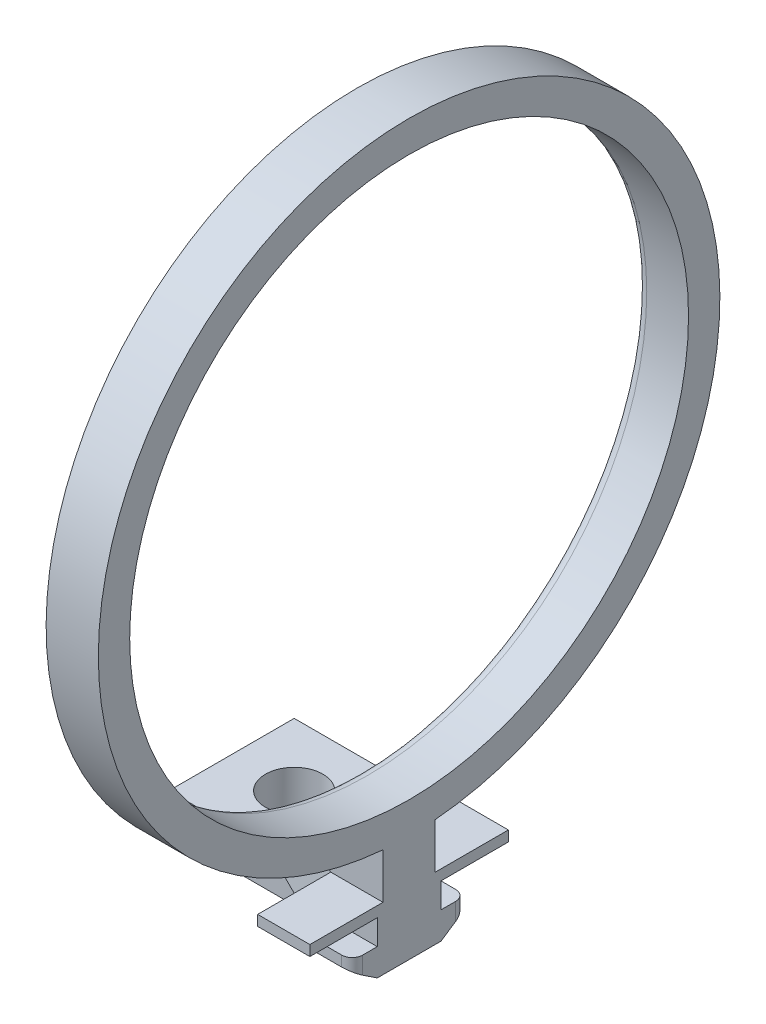
ISO-10303-21;
HEADER;
FILE_DESCRIPTION(('STEP AP214'),'2;1');
FILE_NAME('part.step','',(''),(''),'','','');
FILE_SCHEMA(('AUTOMOTIVE_DESIGN { 1 0 10303 214 1 1 1 1 }'));
ENDSEC;
DATA;
#1=APPLICATION_CONTEXT('core data for automotive mechanical design processes');
#2=APPLICATION_PROTOCOL_DEFINITION('international standard','automotive_design',2000,#1);
#3=PRODUCT_CONTEXT('',#1,'mechanical');
#4=PRODUCT('Part','Part','',(#3));
#5=PRODUCT_RELATED_PRODUCT_CATEGORY('part','',(#4));
#6=PRODUCT_DEFINITION_FORMATION('','',#4);
#7=PRODUCT_DEFINITION_CONTEXT('part definition',#1,'design');
#8=PRODUCT_DEFINITION('design','',#6,#7);
#9=PRODUCT_DEFINITION_SHAPE('','',#8);
#10=(LENGTH_UNIT() NAMED_UNIT(*) SI_UNIT(.MILLI.,.METRE.));
#11=(NAMED_UNIT(*) PLANE_ANGLE_UNIT() SI_UNIT($,.RADIAN.));
#12=(NAMED_UNIT(*) SI_UNIT($,.STERADIAN.) SOLID_ANGLE_UNIT());
#13=UNCERTAINTY_MEASURE_WITH_UNIT(LENGTH_MEASURE(1.E-05),#10,'distance_accuracy_value','');
#14=(GEOMETRIC_REPRESENTATION_CONTEXT(3) GLOBAL_UNCERTAINTY_ASSIGNED_CONTEXT((#13)) GLOBAL_UNIT_ASSIGNED_CONTEXT((#10,
#11,#12)) REPRESENTATION_CONTEXT('',''));
#15=CARTESIAN_POINT('',(0.,0.,0.));
#16=DIRECTION('',(0.,0.,1.));
#17=DIRECTION('',(1.,0.,0.));
#18=AXIS2_PLACEMENT_3D('',#15,#16,#17);
#19=CARTESIAN_POINT('',(-5.,0.,0.));
#20=DIRECTION('',(1.,0.,0.));
#21=DIRECTION('',(0.,0.,-1.));
#22=AXIS2_PLACEMENT_3D('',#19,#20,#21);
#23=PLANE('',#22);
#24=DIRECTION('',(0.,1.,0.));
#25=VECTOR('',#24,1.);
#26=CARTESIAN_POINT('',(-5.,-31.5,5.99999999999999));
#27=LINE('',#26,#25);
#28=CARTESIAN_POINT('',(-5.,-35.,5.99999999999999));
#29=VERTEX_POINT('',#28);
#30=CARTESIAN_POINT('',(-5.,-34.,5.99999999999999));
#31=VERTEX_POINT('',#30);
#32=EDGE_CURVE('E237',#29,#31,#27,.T.);
#33=ORIENTED_EDGE('',*,*,#32,.F.);
#34=DIRECTION('',(0.,0.,-1.));
#35=VECTOR('',#34,1.);
#36=CARTESIAN_POINT('',(-5.,-35.,3.05));
#37=LINE('',#36,#35);
#38=CARTESIAN_POINT('',(-5.,-35.,9.5));
#39=VERTEX_POINT('',#38);
#40=EDGE_CURVE('E260',#39,#29,#37,.T.);
#41=ORIENTED_EDGE('',*,*,#40,.F.);
#42=DIRECTION('',(0.,-1.,0.));
#43=VECTOR('',#42,1.);
#44=CARTESIAN_POINT('',(-5.,-35.,9.5));
#45=LINE('',#44,#43);
#46=CARTESIAN_POINT('',(-5.,-34.,9.50000000000001));
#47=VERTEX_POINT('',#46);
#48=EDGE_CURVE('E254',#47,#39,#45,.T.);
#49=ORIENTED_EDGE('',*,*,#48,.F.);
#50=DIRECTION('',(0.,0.,1.));
#51=VECTOR('',#50,1.);
#52=CARTESIAN_POINT('',(-5.,-34.,9.50000000000001));
#53=LINE('',#52,#51);
#54=EDGE_CURVE('E256',#31,#47,#53,.T.);
#55=ORIENTED_EDGE('',*,*,#54,.F.);
#56=EDGE_LOOP('',(#33,#41,#49,#55));
#57=FACE_BOUND('',#56,.T.);
#58=ADVANCED_FACE('F36',(#57),#23,.F.);
#59=DIRECTION('',(0.,0.,1.));
#60=VECTOR('',#59,1.);
#61=CARTESIAN_POINT('',(-5.,-35.,-6.00000000000001));
#62=LINE('',#61,#60);
#63=CARTESIAN_POINT('',(-5.,-35.,-3.05));
#64=VERTEX_POINT('',#63);
#65=CARTESIAN_POINT('',(-5.,-35.,3.05));
#66=VERTEX_POINT('',#65);
#67=EDGE_CURVE('E413',#64,#66,#62,.T.);
#68=ORIENTED_EDGE('',*,*,#67,.F.);
#69=DIRECTION('',(0.,1.,0.));
#70=VECTOR('',#69,1.);
#71=CARTESIAN_POINT('',(-5.,-35.,-3.05));
#72=LINE('',#71,#70);
#73=CARTESIAN_POINT('',(-5.,-37.4,-3.05));
#74=VERTEX_POINT('',#73);
#75=EDGE_CURVE('E287',#74,#64,#72,.T.);
#76=ORIENTED_EDGE('',*,*,#75,.F.);
#77=DIRECTION('',(0.,0.,1.));
#78=VECTOR('',#77,1.);
#79=CARTESIAN_POINT('',(-5.,-37.4,-3.05));
#80=LINE('',#79,#78);
#81=CARTESIAN_POINT('',(-5.,-37.4,-5.45));
#82=VERTEX_POINT('',#81);
#83=EDGE_CURVE('E284',#82,#74,#80,.T.);
#84=ORIENTED_EDGE('',*,*,#83,.F.);
#85=DIRECTION('',(0.,1.,0.));
#86=VECTOR('',#85,1.);
#87=CARTESIAN_POINT('',(-5.,-37.4,-5.45));
#88=LINE('',#87,#86);
#89=CARTESIAN_POINT('',(-5.,-38.4,-5.45));
#90=VERTEX_POINT('',#89);
#91=EDGE_CURVE('E281',#90,#82,#88,.T.);
#92=ORIENTED_EDGE('',*,*,#91,.F.);
#93=DIRECTION('',(0.,0.55470019622523,-0.832050294337843));
#94=VECTOR('',#93,1.);
#95=CARTESIAN_POINT('',(-5.,-38.4,-5.45));
#96=LINE('',#95,#94);
#97=CARTESIAN_POINT('',(-5.,-40.,-3.05));
#98=VERTEX_POINT('',#97);
#99=EDGE_CURVE('E278',#98,#90,#96,.T.);
#100=ORIENTED_EDGE('',*,*,#99,.F.);
#101=DIRECTION('',(0.,0.,-1.));
#102=VECTOR('',#101,1.);
#103=CARTESIAN_POINT('',(-5.,-40.,-3.05));
#104=LINE('',#103,#102);
#105=CARTESIAN_POINT('',(-5.,-40.,3.05));
#106=VERTEX_POINT('',#105);
#107=EDGE_CURVE('E275',#106,#98,#104,.T.);
#108=ORIENTED_EDGE('',*,*,#107,.F.);
#109=DIRECTION('',(0.,-0.554700196225229,-0.832050294337844));
#110=VECTOR('',#109,1.);
#111=CARTESIAN_POINT('',(-5.,-38.4,5.45));
#112=LINE('',#111,#110);
#113=CARTESIAN_POINT('',(-5.,-38.4,5.45));
#114=VERTEX_POINT('',#113);
#115=EDGE_CURVE('E272',#114,#106,#112,.T.);
#116=ORIENTED_EDGE('',*,*,#115,.F.);
#117=DIRECTION('',(0.,-1.,0.));
#118=VECTOR('',#117,1.);
#119=CARTESIAN_POINT('',(-5.,-37.4,5.45));
#120=LINE('',#119,#118);
#121=CARTESIAN_POINT('',(-5.,-37.4,5.45));
#122=VERTEX_POINT('',#121);
#123=EDGE_CURVE('E269',#122,#114,#120,.T.);
#124=ORIENTED_EDGE('',*,*,#123,.F.);
#125=DIRECTION('',(0.,0.,1.));
#126=VECTOR('',#125,1.);
#127=CARTESIAN_POINT('',(-5.,-37.4,3.05));
#128=LINE('',#127,#126);
#129=CARTESIAN_POINT('',(-5.,-37.4,3.05));
#130=VERTEX_POINT('',#129);
#131=EDGE_CURVE('E266',#130,#122,#128,.T.);
#132=ORIENTED_EDGE('',*,*,#131,.F.);
#133=DIRECTION('',(0.,-1.,0.));
#134=VECTOR('',#133,1.);
#135=CARTESIAN_POINT('',(-5.,-35.,3.05));
#136=LINE('',#135,#134);
#137=EDGE_CURVE('E263',#66,#130,#136,.T.);
#138=ORIENTED_EDGE('',*,*,#137,.F.);
#139=EDGE_LOOP('',(#68,#76,#84,#92,#100,#108,#116,#124,#132,#138));
#140=FACE_BOUND('',#139,.T.);
#141=ADVANCED_FACE('F440',(#140),#23,.F.);
#142=DIRECTION('',(0.,-1.,0.));
#143=VECTOR('',#142,1.);
#144=CARTESIAN_POINT('',(-5.,-31.5,-6.00000000000001));
#145=LINE('',#144,#143);
#146=CARTESIAN_POINT('',(-5.,-34.,-6.00000000000001));
#147=VERTEX_POINT('',#146);
#148=CARTESIAN_POINT('',(-5.,-35.,-6.00000000000001));
#149=VERTEX_POINT('',#148);
#150=EDGE_CURVE('E465',#147,#149,#145,.T.);
#151=ORIENTED_EDGE('',*,*,#150,.F.);
#152=CARTESIAN_POINT('',(-5.,-34.,-9.5));
#153=VERTEX_POINT('',#152);
#154=EDGE_CURVE('E251',#153,#147,#53,.T.);
#155=ORIENTED_EDGE('',*,*,#154,.F.);
#156=DIRECTION('',(0.,1.,0.));
#157=VECTOR('',#156,1.);
#158=CARTESIAN_POINT('',(-5.,-34.,-9.5));
#159=LINE('',#158,#157);
#160=CARTESIAN_POINT('',(-5.,-35.,-9.5));
#161=VERTEX_POINT('',#160);
#162=EDGE_CURVE('E292',#161,#153,#159,.T.);
#163=ORIENTED_EDGE('',*,*,#162,.F.);
#164=DIRECTION('',(0.,0.,-1.));
#165=VECTOR('',#164,1.);
#166=CARTESIAN_POINT('',(-5.,-35.,-3.05));
#167=LINE('',#166,#165);
#168=EDGE_CURVE('E290',#149,#161,#167,.T.);
#169=ORIENTED_EDGE('',*,*,#168,.F.);
#170=EDGE_LOOP('',(#151,#155,#163,#169));
#171=FACE_BOUND('',#170,.T.);
#172=ADVANCED_FACE('F446',(#171),#23,.F.);
#173=CARTESIAN_POINT('',(-5.,0.,0.));
#174=DIRECTION('',(1.,0.,0.));
#175=DIRECTION('',(0.,0.,-1.));
#176=AXIS2_PLACEMENT_3D('',#173,#174,#175);
#177=CIRCLE('',#176,27.75);
#178=CARTESIAN_POINT('',(-5.,0.,-27.75));
#179=VERTEX_POINT('',#178);
#180=EDGE_CURVE('E44',#179,#179,#177,.T.);
#181=ORIENTED_EDGE('',*,*,#180,.T.);
#182=EDGE_LOOP('',(#181));
#183=FACE_BOUND('',#182,.T.);
#184=DIRECTION('',(0.,0.,-1.));
#185=VECTOR('',#184,1.);
#186=CARTESIAN_POINT('',(-5.,-31.5,-6.00000000000001));
#187=LINE('',#186,#185);
#188=CARTESIAN_POINT('',(-5.,-31.5,2.5));
#189=VERTEX_POINT('',#188);
#190=CARTESIAN_POINT('',(-5.,-31.5,-2.5));
#191=VERTEX_POINT('',#190);
#192=EDGE_CURVE('E410',#189,#191,#187,.T.);
#193=ORIENTED_EDGE('',*,*,#192,.F.);
#194=DIRECTION('',(0.,-1.,0.));
#195=VECTOR('',#194,1.);
#196=CARTESIAN_POINT('',(-5.,-35.,2.5));
#197=LINE('',#196,#195);
#198=CARTESIAN_POINT('',(-5.,-29.6447718830825,2.5));
#199=VERTEX_POINT('',#198);
#200=EDGE_CURVE('E367',#199,#189,#197,.T.);
#201=ORIENTED_EDGE('',*,*,#200,.F.);
#202=CARTESIAN_POINT('',(-5.,0.,0.));
#203=DIRECTION('',(1.,0.,0.));
#204=DIRECTION('',(0.,0.,-1.));
#205=AXIS2_PLACEMENT_3D('',#202,#203,#204);
#206=CIRCLE('',#205,29.75);
#207=CARTESIAN_POINT('',(-5.,-29.6447718830825,-2.5));
#208=VERTEX_POINT('',#207);
#209=EDGE_CURVE('E381',#208,#199,#206,.T.);
#210=ORIENTED_EDGE('',*,*,#209,.F.);
#211=DIRECTION('',(0.,1.,0.));
#212=VECTOR('',#211,1.);
#213=CARTESIAN_POINT('',(-5.,-35.,-2.5));
#214=LINE('',#213,#212);
#215=EDGE_CURVE('E365',#191,#208,#214,.T.);
#216=ORIENTED_EDGE('',*,*,#215,.F.);
#217=EDGE_LOOP('',(#193,#201,#210,#216));
#218=FACE_BOUND('',#217,.T.);
#219=ADVANCED_FACE('F427',(#183,#218),#23,.F.);
#220=CARTESIAN_POINT('',(-5.,0.,0.));
#221=DIRECTION('',(1.,0.,0.));
#222=DIRECTION('',(0.,0.,-1.));
#223=AXIS2_PLACEMENT_3D('',#220,#221,#222);
#224=CYLINDRICAL_SURFACE('',#223,29.75);
#225=DIRECTION('',(1.,0.,0.));
#226=VECTOR('',#225,1.);
#227=CARTESIAN_POINT('',(-5.,-29.6447718830825,2.5));
#228=LINE('',#227,#226);
#229=CARTESIAN_POINT('',(0.,-29.6447718830825,2.5));
#230=VERTEX_POINT('',#229);
#231=EDGE_CURVE('E375',#199,#230,#228,.T.);
#232=ORIENTED_EDGE('',*,*,#231,.T.);
#233=CARTESIAN_POINT('',(0.,0.,0.));
#234=DIRECTION('',(1.,0.,0.));
#235=DIRECTION('',(0.,0.,-1.));
#236=AXIS2_PLACEMENT_3D('',#233,#234,#235);
#237=CIRCLE('',#236,29.75);
#238=CARTESIAN_POINT('',(0.,-29.6447718830825,-2.50000000000004));
#239=VERTEX_POINT('',#238);
#240=EDGE_CURVE('E378',#239,#230,#237,.T.);
#241=ORIENTED_EDGE('',*,*,#240,.F.);
#242=DIRECTION('',(1.,0.,0.));
#243=VECTOR('',#242,1.);
#244=CARTESIAN_POINT('',(-5.,-29.6447718830825,-2.5));
#245=LINE('',#244,#243);
#246=EDGE_CURVE('E371',#208,#239,#245,.T.);
#247=ORIENTED_EDGE('',*,*,#246,.F.);
#248=ORIENTED_EDGE('',*,*,#209,.T.);
#249=EDGE_LOOP('',(#232,#241,#247,#248));
#250=FACE_BOUND('',#249,.T.);
#251=ADVANCED_FACE('F451',(#250),#224,.T.);
#252=CARTESIAN_POINT('',(-5.,0.,0.));
#253=DIRECTION('',(1.,0.,0.));
#254=DIRECTION('',(0.,0.,-1.));
#255=AXIS2_PLACEMENT_3D('',#252,#253,#254);
#256=CYLINDRICAL_SURFACE('',#255,26.75);
#257=CARTESIAN_POINT('',(-4.,0.,0.));
#258=DIRECTION('',(1.,0.,0.));
#259=DIRECTION('',(0.,0.,-1.));
#260=AXIS2_PLACEMENT_3D('',#257,#258,#259);
#261=CIRCLE('',#260,26.75);
#262=CARTESIAN_POINT('',(-4.,0.,-26.75));
#263=VERTEX_POINT('',#262);
#264=EDGE_CURVE('E11',#263,#263,#261,.F.);
#265=ORIENTED_EDGE('',*,*,#264,.T.);
#266=EDGE_LOOP('',(#265));
#267=FACE_BOUND('',#266,.T.);
#268=CARTESIAN_POINT('',(0.,0.,0.));
#269=DIRECTION('',(1.,0.,0.));
#270=DIRECTION('',(0.,0.,-1.));
#271=AXIS2_PLACEMENT_3D('',#268,#269,#270);
#272=CIRCLE('',#271,26.75);
#273=CARTESIAN_POINT('',(0.,0.,-26.75));
#274=VERTEX_POINT('',#273);
#275=EDGE_CURVE('E385',#274,#274,#272,.T.);
#276=ORIENTED_EDGE('',*,*,#275,.T.);
#277=EDGE_LOOP('',(#276));
#278=FACE_BOUND('',#277,.T.);
#279=ADVANCED_FACE('F456',(#267,#278),#256,.F.);
#280=CARTESIAN_POINT('',(0.,0.,0.));
#281=DIRECTION('',(1.,0.,0.));
#282=DIRECTION('',(0.,0.,-1.));
#283=AXIS2_PLACEMENT_3D('',#280,#281,#282);
#284=PLANE('',#283);
#285=DIRECTION('',(0.,0.,1.));
#286=VECTOR('',#285,1.);
#287=CARTESIAN_POINT('',(0.,-37.4,3.05));
#288=LINE('',#287,#286);
#289=CARTESIAN_POINT('',(0.,-37.4,3.05));
#290=VERTEX_POINT('',#289);
#291=CARTESIAN_POINT('',(0.,-37.4,4.45));
#292=VERTEX_POINT('',#291);
#293=EDGE_CURVE('E306',#290,#292,#288,.T.);
#294=ORIENTED_EDGE('',*,*,#293,.T.);
#295=DIRECTION('',(0.,-1.,0.));
#296=VECTOR('',#295,1.);
#297=CARTESIAN_POINT('',(0.,0.,4.45000000000013));
#298=LINE('',#297,#296);
#299=CARTESIAN_POINT('',(0.,-39.0666666666667,4.44999999999999));
#300=VERTEX_POINT('',#299);
#301=EDGE_CURVE('E395',#292,#300,#298,.T.);
#302=ORIENTED_EDGE('',*,*,#301,.T.);
#303=DIRECTION('',(0.,-0.554700196225229,-0.832050294337844));
#304=VECTOR('',#303,1.);
#305=CARTESIAN_POINT('',(0.,-38.4,5.45));
#306=LINE('',#305,#304);
#307=CARTESIAN_POINT('',(0.,-40.,3.05));
#308=VERTEX_POINT('',#307);
#309=EDGE_CURVE('E309',#300,#308,#306,.T.);
#310=ORIENTED_EDGE('',*,*,#309,.T.);
#311=DIRECTION('',(0.,0.,-1.));
#312=VECTOR('',#311,1.);
#313=CARTESIAN_POINT('',(0.,-40.,-3.05));
#314=LINE('',#313,#312);
#315=CARTESIAN_POINT('',(0.,-40.,-3.05));
#316=VERTEX_POINT('',#315);
#317=EDGE_CURVE('E311',#308,#316,#314,.T.);
#318=ORIENTED_EDGE('',*,*,#317,.T.);
#319=DIRECTION('',(0.,0.55470019622523,-0.832050294337843));
#320=VECTOR('',#319,1.);
#321=CARTESIAN_POINT('',(0.,-38.4,-5.45));
#322=LINE('',#321,#320);
#323=CARTESIAN_POINT('',(0.,-39.0666666666667,-4.45));
#324=VERTEX_POINT('',#323);
#325=EDGE_CURVE('E314',#316,#324,#322,.T.);
#326=ORIENTED_EDGE('',*,*,#325,.T.);
#327=DIRECTION('',(0.,1.,0.));
#328=VECTOR('',#327,1.);
#329=CARTESIAN_POINT('',(0.,0.,-4.45000000000003));
#330=LINE('',#329,#328);
#331=CARTESIAN_POINT('',(0.,-37.4,-4.45));
#332=VERTEX_POINT('',#331);
#333=EDGE_CURVE('E392',#324,#332,#330,.T.);
#334=ORIENTED_EDGE('',*,*,#333,.T.);
#335=DIRECTION('',(0.,0.,1.));
#336=VECTOR('',#335,1.);
#337=CARTESIAN_POINT('',(0.,-37.4,-3.05));
#338=LINE('',#337,#336);
#339=CARTESIAN_POINT('',(0.,-37.4,-3.05));
#340=VERTEX_POINT('',#339);
#341=EDGE_CURVE('E317',#332,#340,#338,.T.);
#342=ORIENTED_EDGE('',*,*,#341,.T.);
#343=DIRECTION('',(0.,1.,0.));
#344=VECTOR('',#343,1.);
#345=CARTESIAN_POINT('',(0.,-35.,-3.05));
#346=LINE('',#345,#344);
#347=CARTESIAN_POINT('',(0.,-35.,-3.05));
#348=VERTEX_POINT('',#347);
#349=EDGE_CURVE('E319',#340,#348,#346,.T.);
#350=ORIENTED_EDGE('',*,*,#349,.T.);
#351=DIRECTION('',(0.,0.,-1.));
#352=VECTOR('',#351,1.);
#353=CARTESIAN_POINT('',(0.,-35.,-3.05));
#354=LINE('',#353,#352);
#355=CARTESIAN_POINT('',(0.,-35.,-9.5));
#356=VERTEX_POINT('',#355);
#357=EDGE_CURVE('E322',#348,#356,#354,.T.);
#358=ORIENTED_EDGE('',*,*,#357,.T.);
#359=DIRECTION('',(0.,1.,0.));
#360=VECTOR('',#359,1.);
#361=CARTESIAN_POINT('',(0.,-34.,-9.5));
#362=LINE('',#361,#360);
#363=CARTESIAN_POINT('',(0.,-34.,-9.5));
#364=VERTEX_POINT('',#363);
#365=EDGE_CURVE('E325',#356,#364,#362,.T.);
#366=ORIENTED_EDGE('',*,*,#365,.T.);
#367=DIRECTION('',(0.,0.,1.));
#368=VECTOR('',#367,1.);
#369=CARTESIAN_POINT('',(0.,-34.,9.50000000000001));
#370=LINE('',#369,#368);
#371=CARTESIAN_POINT('',(0.,-34.,-2.5));
#372=VERTEX_POINT('',#371);
#373=EDGE_CURVE('E245',#364,#372,#370,.T.);
#374=ORIENTED_EDGE('',*,*,#373,.T.);
#375=DIRECTION('',(0.,1.,0.));
#376=VECTOR('',#375,1.);
#377=CARTESIAN_POINT('',(0.,-35.,-2.5));
#378=LINE('',#377,#376);
#379=EDGE_CURVE('E364',#372,#239,#378,.T.);
#380=ORIENTED_EDGE('',*,*,#379,.T.);
#381=ORIENTED_EDGE('',*,*,#240,.T.);
#382=DIRECTION('',(0.,-1.,0.));
#383=VECTOR('',#382,1.);
#384=CARTESIAN_POINT('',(0.,-35.,2.5));
#385=LINE('',#384,#383);
#386=CARTESIAN_POINT('',(0.,-34.,2.5));
#387=VERTEX_POINT('',#386);
#388=EDGE_CURVE('E368',#230,#387,#385,.T.);
#389=ORIENTED_EDGE('',*,*,#388,.T.);
#390=CARTESIAN_POINT('',(0.,-34.,9.50000000000001));
#391=VERTEX_POINT('',#390);
#392=EDGE_CURVE('E243',#387,#391,#370,.T.);
#393=ORIENTED_EDGE('',*,*,#392,.T.);
#394=DIRECTION('',(0.,-1.,0.));
#395=VECTOR('',#394,1.);
#396=CARTESIAN_POINT('',(0.,-35.,9.5));
#397=LINE('',#396,#395);
#398=CARTESIAN_POINT('',(0.,-35.,9.5));
#399=VERTEX_POINT('',#398);
#400=EDGE_CURVE('E297',#391,#399,#397,.T.);
#401=ORIENTED_EDGE('',*,*,#400,.T.);
#402=DIRECTION('',(0.,0.,-1.));
#403=VECTOR('',#402,1.);
#404=CARTESIAN_POINT('',(0.,-35.,3.05));
#405=LINE('',#404,#403);
#406=CARTESIAN_POINT('',(0.,-35.,3.05));
#407=VERTEX_POINT('',#406);
#408=EDGE_CURVE('E300',#399,#407,#405,.T.);
#409=ORIENTED_EDGE('',*,*,#408,.T.);
#410=DIRECTION('',(0.,-1.,0.));
#411=VECTOR('',#410,1.);
#412=CARTESIAN_POINT('',(0.,-35.,3.05));
#413=LINE('',#412,#411);
#414=EDGE_CURVE('E303',#407,#290,#413,.T.);
#415=ORIENTED_EDGE('',*,*,#414,.T.);
#416=EDGE_LOOP('',(#294,#302,#310,#318,#326,#334,#342,#350,#358,#366,#374,#380,#381,#389,#393,
#401,#409,#415));
#417=FACE_BOUND('',#416,.T.);
#418=ORIENTED_EDGE('',*,*,#275,.F.);
#419=EDGE_LOOP('',(#418));
#420=FACE_BOUND('',#419,.T.);
#421=ADVANCED_FACE('F574',(#417,#420),#284,.T.);
#422=CARTESIAN_POINT('',(-5.,-35.,-2.5));
#423=DIRECTION('',(0.,0.,-1.));
#424=DIRECTION('',(0.,1.,0.));
#425=AXIS2_PLACEMENT_3D('',#422,#423,#424);
#426=PLANE('',#425);
#427=DIRECTION('',(1.,0.,0.));
#428=VECTOR('',#427,1.);
#429=CARTESIAN_POINT('',(-5.,-34.,-2.5));
#430=LINE('',#429,#428);
#431=CARTESIAN_POINT('',(-5.,-34.,-2.5));
#432=VERTEX_POINT('',#431);
#433=EDGE_CURVE('E330',#432,#372,#430,.T.);
#434=ORIENTED_EDGE('',*,*,#433,.F.);
#435=DIRECTION('',(0.707106781186546,-0.707106781186549,0.));
#436=VECTOR('',#435,1.);
#437=CARTESIAN_POINT('',(-7.50000000000003,-31.5,-2.5));
#438=LINE('',#437,#436);
#439=CARTESIAN_POINT('',(-7.50000000000003,-31.5,-2.5));
#440=VERTEX_POINT('',#439);
#441=EDGE_CURVE('E423',#432,#440,#438,.F.);
#442=ORIENTED_EDGE('',*,*,#441,.T.);
#443=DIRECTION('',(-1.,0.,0.));
#444=VECTOR('',#443,1.);
#445=CARTESIAN_POINT('',(-5.,-31.5,-2.5));
#446=LINE('',#445,#444);
#447=EDGE_CURVE('E51',#191,#440,#446,.T.);
#448=ORIENTED_EDGE('',*,*,#447,.F.);
#449=ORIENTED_EDGE('',*,*,#215,.T.);
#450=ORIENTED_EDGE('',*,*,#246,.T.);
#451=ORIENTED_EDGE('',*,*,#379,.F.);
#452=EDGE_LOOP('',(#434,#442,#448,#449,#450,#451));
#453=FACE_BOUND('',#452,.T.);
#454=ADVANCED_FACE('F571',(#453),#426,.T.);
#455=CARTESIAN_POINT('',(-5.,-35.,2.5));
#456=DIRECTION('',(0.,0.,1.));
#457=DIRECTION('',(0.,-1.,0.));
#458=AXIS2_PLACEMENT_3D('',#455,#456,#457);
#459=PLANE('',#458);
#460=DIRECTION('',(-1.,0.,0.));
#461=VECTOR('',#460,1.);
#462=CARTESIAN_POINT('',(-5.,-34.,2.5));
#463=LINE('',#462,#461);
#464=CARTESIAN_POINT('',(-5.,-34.,2.5));
#465=VERTEX_POINT('',#464);
#466=EDGE_CURVE('E384',#387,#465,#463,.T.);
#467=ORIENTED_EDGE('',*,*,#466,.F.);
#468=ORIENTED_EDGE('',*,*,#388,.F.);
#469=ORIENTED_EDGE('',*,*,#231,.F.);
#470=ORIENTED_EDGE('',*,*,#200,.T.);
#471=DIRECTION('',(1.,0.,0.));
#472=VECTOR('',#471,1.);
#473=CARTESIAN_POINT('',(-5.,-31.5,2.5));
#474=LINE('',#473,#472);
#475=CARTESIAN_POINT('',(-7.50000000000003,-31.5,2.5));
#476=VERTEX_POINT('',#475);
#477=EDGE_CURVE('E415',#476,#189,#474,.T.);
#478=ORIENTED_EDGE('',*,*,#477,.F.);
#479=DIRECTION('',(-0.707106781186546,0.707106781186549,0.));
#480=VECTOR('',#479,1.);
#481=CARTESIAN_POINT('',(-7.50000000000003,-31.5,2.5));
#482=LINE('',#481,#480);
#483=EDGE_CURVE('E59',#476,#465,#482,.F.);
#484=ORIENTED_EDGE('',*,*,#483,.T.);
#485=EDGE_LOOP('',(#467,#468,#469,#470,#478,#484));
#486=FACE_BOUND('',#485,.T.);
#487=ADVANCED_FACE('F569',(#486),#459,.T.);
#488=CARTESIAN_POINT('',(-5.,-34.,9.50000000000001));
#489=DIRECTION('',(0.,1.,0.));
#490=DIRECTION('',(0.,0.,1.));
#491=AXIS2_PLACEMENT_3D('',#488,#489,#490);
#492=PLANE('',#491);
#493=ORIENTED_EDGE('',*,*,#154,.T.);
#494=EDGE_CURVE('E255',#147,#432,#53,.T.);
#495=ORIENTED_EDGE('',*,*,#494,.T.);
#496=ORIENTED_EDGE('',*,*,#433,.T.);
#497=ORIENTED_EDGE('',*,*,#373,.F.);
#498=DIRECTION('',(1.,0.,0.));
#499=VECTOR('',#498,1.);
#500=CARTESIAN_POINT('',(-5.,-34.,-9.5));
#501=LINE('',#500,#499);
#502=EDGE_CURVE('E328',#153,#364,#501,.T.);
#503=ORIENTED_EDGE('',*,*,#502,.F.);
#504=EDGE_LOOP('',(#493,#495,#496,#497,#503));
#505=FACE_BOUND('',#504,.T.);
#506=ADVANCED_FACE('F473',(#505),#492,.T.);
#507=ORIENTED_EDGE('',*,*,#392,.F.);
#508=ORIENTED_EDGE('',*,*,#466,.T.);
#509=EDGE_CURVE('E257',#465,#31,#53,.T.);
#510=ORIENTED_EDGE('',*,*,#509,.T.);
#511=ORIENTED_EDGE('',*,*,#54,.T.);
#512=DIRECTION('',(1.,0.,0.));
#513=VECTOR('',#512,1.);
#514=CARTESIAN_POINT('',(-5.,-34.,9.50000000000001));
#515=LINE('',#514,#513);
#516=EDGE_CURVE('E294',#47,#391,#515,.T.);
#517=ORIENTED_EDGE('',*,*,#516,.T.);
#518=EDGE_LOOP('',(#507,#508,#510,#511,#517));
#519=FACE_BOUND('',#518,.T.);
#520=ADVANCED_FACE('F481',(#519),#492,.T.);
#521=CARTESIAN_POINT('',(-5.,-34.,-9.5));
#522=DIRECTION('',(0.,0.,-1.));
#523=DIRECTION('',(-1.,0.,0.));
#524=AXIS2_PLACEMENT_3D('',#521,#522,#523);
#525=PLANE('',#524);
#526=ORIENTED_EDGE('',*,*,#365,.F.);
#527=DIRECTION('',(1.,0.,0.));
#528=VECTOR('',#527,1.);
#529=CARTESIAN_POINT('',(-5.,-35.,-9.5));
#530=LINE('',#529,#528);
#531=EDGE_CURVE('E331',#161,#356,#530,.T.);
#532=ORIENTED_EDGE('',*,*,#531,.F.);
#533=ORIENTED_EDGE('',*,*,#162,.T.);
#534=ORIENTED_EDGE('',*,*,#502,.T.);
#535=EDGE_LOOP('',(#526,#532,#533,#534));
#536=FACE_BOUND('',#535,.T.);
#537=ADVANCED_FACE('F521',(#536),#525,.T.);
#538=CARTESIAN_POINT('',(-5.,-35.,-3.05));
#539=DIRECTION('',(0.,-1.,0.));
#540=DIRECTION('',(0.,0.,-1.));
#541=AXIS2_PLACEMENT_3D('',#538,#539,#540);
#542=PLANE('',#541);
#543=CARTESIAN_POINT('',(-11.,-35.,0.));
#544=DIRECTION('',(0.,-1.,0.));
#545=DIRECTION('',(0.,0.,-1.));
#546=AXIS2_PLACEMENT_3D('',#543,#544,#545);
#547=CIRCLE('',#546,2.75);
#548=CARTESIAN_POINT('',(-11.,-35.,-2.75000000000001));
#549=VERTEX_POINT('',#548);
#550=EDGE_CURVE('E501',#549,#549,#547,.F.);
#551=ORIENTED_EDGE('',*,*,#550,.T.);
#552=EDGE_LOOP('',(#551));
#553=FACE_BOUND('',#552,.T.);
#554=ORIENTED_EDGE('',*,*,#357,.F.);
#555=DIRECTION('',(1.,0.,0.));
#556=VECTOR('',#555,1.);
#557=CARTESIAN_POINT('',(-5.,-35.,-3.05));
#558=LINE('',#557,#556);
#559=EDGE_CURVE('E333',#64,#348,#558,.T.);
#560=ORIENTED_EDGE('',*,*,#559,.F.);
#561=ORIENTED_EDGE('',*,*,#67,.T.);
#562=DIRECTION('',(1.,0.,0.));
#563=VECTOR('',#562,1.);
#564=CARTESIAN_POINT('',(-5.,-35.,3.05));
#565=LINE('',#564,#563);
#566=EDGE_CURVE('E357',#66,#407,#565,.T.);
#567=ORIENTED_EDGE('',*,*,#566,.T.);
#568=ORIENTED_EDGE('',*,*,#408,.F.);
#569=DIRECTION('',(1.,0.,0.));
#570=VECTOR('',#569,1.);
#571=CARTESIAN_POINT('',(-5.,-35.,9.5));
#572=LINE('',#571,#570);
#573=EDGE_CURVE('E359',#39,#399,#572,.T.);
#574=ORIENTED_EDGE('',*,*,#573,.F.);
#575=ORIENTED_EDGE('',*,*,#40,.T.);
#576=DIRECTION('',(1.,0.,0.));
#577=VECTOR('',#576,1.);
#578=CARTESIAN_POINT('',(-17.,-35.,5.99999999999999));
#579=LINE('',#578,#577);
#580=CARTESIAN_POINT('',(-17.,-35.,5.99999999999999));
#581=VERTEX_POINT('',#580);
#582=EDGE_CURVE('E490',#581,#29,#579,.T.);
#583=ORIENTED_EDGE('',*,*,#582,.F.);
#584=DIRECTION('',(0.,0.,1.));
#585=VECTOR('',#584,1.);
#586=CARTESIAN_POINT('',(-17.,-35.,-6.00000000000001));
#587=LINE('',#586,#585);
#588=CARTESIAN_POINT('',(-17.,-35.,-6.00000000000001));
#589=VERTEX_POINT('',#588);
#590=EDGE_CURVE('E233',#589,#581,#587,.T.);
#591=ORIENTED_EDGE('',*,*,#590,.F.);
#592=DIRECTION('',(1.,0.,0.));
#593=VECTOR('',#592,1.);
#594=CARTESIAN_POINT('',(-17.,-35.,-6.00000000000001));
#595=LINE('',#594,#593);
#596=EDGE_CURVE('E247',#589,#149,#595,.T.);
#597=ORIENTED_EDGE('',*,*,#596,.T.);
#598=ORIENTED_EDGE('',*,*,#168,.T.);
#599=ORIENTED_EDGE('',*,*,#531,.T.);
#600=EDGE_LOOP('',(#554,#560,#561,#567,#568,#574,#575,#583,#591,#597,#598,#599));
#601=FACE_BOUND('',#600,.T.);
#602=ADVANCED_FACE('F489',(#553,#601),#542,.T.);
#603=CARTESIAN_POINT('',(-5.,-35.,-3.05));
#604=DIRECTION('',(0.,0.,-1.));
#605=DIRECTION('',(0.,1.,0.));
#606=AXIS2_PLACEMENT_3D('',#603,#604,#605);
#607=PLANE('',#606);
#608=ORIENTED_EDGE('',*,*,#349,.F.);
#609=DIRECTION('',(1.,0.,0.));
#610=VECTOR('',#609,1.);
#611=CARTESIAN_POINT('',(-5.,-37.4,-3.05));
#612=LINE('',#611,#610);
#613=EDGE_CURVE('E335',#74,#340,#612,.T.);
#614=ORIENTED_EDGE('',*,*,#613,.F.);
#615=ORIENTED_EDGE('',*,*,#75,.T.);
#616=ORIENTED_EDGE('',*,*,#559,.T.);
#617=EDGE_LOOP('',(#608,#614,#615,#616));
#618=FACE_BOUND('',#617,.T.);
#619=ADVANCED_FACE('F527',(#618),#607,.T.);
#620=CARTESIAN_POINT('',(-5.,-37.4,-3.05));
#621=DIRECTION('',(0.,1.,0.));
#622=DIRECTION('',(0.,0.,1.));
#623=AXIS2_PLACEMENT_3D('',#620,#621,#622);
#624=PLANE('',#623);
#625=ORIENTED_EDGE('',*,*,#341,.F.);
#626=CARTESIAN_POINT('',(-1.,-37.4,-4.45));
#627=DIRECTION('',(0.,1.,0.));
#628=DIRECTION('',(0.,0.,1.));
#629=AXIS2_PLACEMENT_3D('',#626,#627,#628);
#630=CIRCLE('',#629,1.);
#631=CARTESIAN_POINT('',(-1.,-37.4,-5.45));
#632=VERTEX_POINT('',#631);
#633=EDGE_CURVE('E404',#332,#632,#630,.T.);
#634=ORIENTED_EDGE('',*,*,#633,.T.);
#635=DIRECTION('',(1.,0.,0.));
#636=VECTOR('',#635,1.);
#637=CARTESIAN_POINT('',(-5.,-37.4,-5.45));
#638=LINE('',#637,#636);
#639=EDGE_CURVE('E338',#82,#632,#638,.T.);
#640=ORIENTED_EDGE('',*,*,#639,.F.);
#641=ORIENTED_EDGE('',*,*,#83,.T.);
#642=ORIENTED_EDGE('',*,*,#613,.T.);
#643=EDGE_LOOP('',(#625,#634,#640,#641,#642));
#644=FACE_BOUND('',#643,.T.);
#645=ADVANCED_FACE('F531',(#644),#624,.T.);
#646=CARTESIAN_POINT('',(-5.,-37.4,-5.45));
#647=DIRECTION('',(0.,0.,-1.));
#648=DIRECTION('',(0.,1.,0.));
#649=AXIS2_PLACEMENT_3D('',#646,#647,#648);
#650=PLANE('',#649);
#651=ORIENTED_EDGE('',*,*,#639,.T.);
#652=DIRECTION('',(0.,1.,0.));
#653=VECTOR('',#652,1.);
#654=CARTESIAN_POINT('',(-1.,-37.4,-5.45));
#655=LINE('',#654,#653);
#656=CARTESIAN_POINT('',(-1.,-38.4,-5.45));
#657=VERTEX_POINT('',#656);
#658=EDGE_CURVE('E406',#632,#657,#655,.F.);
#659=ORIENTED_EDGE('',*,*,#658,.T.);
#660=DIRECTION('',(1.,0.,0.));
#661=VECTOR('',#660,1.);
#662=CARTESIAN_POINT('',(-5.,-38.4,-5.45));
#663=LINE('',#662,#661);
#664=EDGE_CURVE('E341',#90,#657,#663,.T.);
#665=ORIENTED_EDGE('',*,*,#664,.F.);
#666=ORIENTED_EDGE('',*,*,#91,.T.);
#667=EDGE_LOOP('',(#651,#659,#665,#666));
#668=FACE_BOUND('',#667,.T.);
#669=ADVANCED_FACE('F535',(#668),#650,.T.);
#670=CARTESIAN_POINT('',(-5.,-38.4,-5.45));
#671=DIRECTION('',(0.,-0.832050294337843,-0.55470019622523));
#672=DIRECTION('',(0.,0.55470019622523,-0.832050294337843));
#673=AXIS2_PLACEMENT_3D('',#670,#671,#672);
#674=PLANE('',#673);
#675=ORIENTED_EDGE('',*,*,#664,.T.);
#676=CARTESIAN_POINT('',(-1.,-39.0666666666667,-4.45));
#677=DIRECTION('',(0.,-0.832050294337843,-0.55470019622523));
#678=DIRECTION('',(0.,0.55470019622523,-0.832050294337843));
#679=AXIS2_PLACEMENT_3D('',#676,#677,#678);
#680=ELLIPSE('',#679,1.20185042515466,1.);
#681=EDGE_CURVE('E408',#657,#324,#680,.T.);
#682=ORIENTED_EDGE('',*,*,#681,.T.);
#683=ORIENTED_EDGE('',*,*,#325,.F.);
#684=DIRECTION('',(1.,0.,0.));
#685=VECTOR('',#684,1.);
#686=CARTESIAN_POINT('',(-5.,-40.,-3.05));
#687=LINE('',#686,#685);
#688=EDGE_CURVE('E344',#98,#316,#687,.T.);
#689=ORIENTED_EDGE('',*,*,#688,.F.);
#690=ORIENTED_EDGE('',*,*,#99,.T.);
#691=EDGE_LOOP('',(#675,#682,#683,#689,#690));
#692=FACE_BOUND('',#691,.T.);
#693=ADVANCED_FACE('F539',(#692),#674,.T.);
#694=CARTESIAN_POINT('',(-5.,-40.,-3.05));
#695=DIRECTION('',(0.,-1.,0.));
#696=DIRECTION('',(0.,0.,-1.));
#697=AXIS2_PLACEMENT_3D('',#694,#695,#696);
#698=PLANE('',#697);
#699=ORIENTED_EDGE('',*,*,#317,.F.);
#700=DIRECTION('',(1.,0.,0.));
#701=VECTOR('',#700,1.);
#702=CARTESIAN_POINT('',(-5.,-40.,3.05));
#703=LINE('',#702,#701);
#704=EDGE_CURVE('E346',#106,#308,#703,.T.);
#705=ORIENTED_EDGE('',*,*,#704,.F.);
#706=ORIENTED_EDGE('',*,*,#107,.T.);
#707=ORIENTED_EDGE('',*,*,#688,.T.);
#708=EDGE_LOOP('',(#699,#705,#706,#707));
#709=FACE_BOUND('',#708,.T.);
#710=ADVANCED_FACE('F543',(#709),#698,.T.);
#711=CARTESIAN_POINT('',(-5.,-38.4,5.45));
#712=DIRECTION('',(0.,-0.832050294337844,0.554700196225229));
#713=DIRECTION('',(0.,-0.554700196225229,-0.832050294337844));
#714=AXIS2_PLACEMENT_3D('',#711,#712,#713);
#715=PLANE('',#714);
#716=ORIENTED_EDGE('',*,*,#309,.F.);
#717=CARTESIAN_POINT('',(-1.,-39.0666666666667,4.44999999999999));
#718=DIRECTION('',(0.,-0.832050294337844,0.554700196225229));
#719=DIRECTION('',(0.,-0.554700196225229,-0.832050294337844));
#720=AXIS2_PLACEMENT_3D('',#717,#718,#719);
#721=ELLIPSE('',#720,1.20185042515467,1.);
#722=CARTESIAN_POINT('',(-1.,-38.4,5.45));
#723=VERTEX_POINT('',#722);
#724=EDGE_CURVE('E398',#300,#723,#721,.T.);
#725=ORIENTED_EDGE('',*,*,#724,.T.);
#726=DIRECTION('',(1.,0.,0.));
#727=VECTOR('',#726,1.);
#728=CARTESIAN_POINT('',(-5.,-38.4,5.45));
#729=LINE('',#728,#727);
#730=EDGE_CURVE('E349',#114,#723,#729,.T.);
#731=ORIENTED_EDGE('',*,*,#730,.F.);
#732=ORIENTED_EDGE('',*,*,#115,.T.);
#733=ORIENTED_EDGE('',*,*,#704,.T.);
#734=EDGE_LOOP('',(#716,#725,#731,#732,#733));
#735=FACE_BOUND('',#734,.T.);
#736=ADVANCED_FACE('F547',(#735),#715,.T.);
#737=CARTESIAN_POINT('',(-5.,-37.4,5.45));
#738=DIRECTION('',(0.,0.,1.));
#739=DIRECTION('',(0.,-1.,0.));
#740=AXIS2_PLACEMENT_3D('',#737,#738,#739);
#741=PLANE('',#740);
#742=ORIENTED_EDGE('',*,*,#730,.T.);
#743=DIRECTION('',(0.,-1.,0.));
#744=VECTOR('',#743,1.);
#745=CARTESIAN_POINT('',(-1.,-37.4,5.45));
#746=LINE('',#745,#744);
#747=CARTESIAN_POINT('',(-1.,-37.4,5.45));
#748=VERTEX_POINT('',#747);
#749=EDGE_CURVE('E400',#723,#748,#746,.F.);
#750=ORIENTED_EDGE('',*,*,#749,.T.);
#751=DIRECTION('',(1.,0.,0.));
#752=VECTOR('',#751,1.);
#753=CARTESIAN_POINT('',(-5.,-37.4,5.45));
#754=LINE('',#753,#752);
#755=EDGE_CURVE('E352',#122,#748,#754,.T.);
#756=ORIENTED_EDGE('',*,*,#755,.F.);
#757=ORIENTED_EDGE('',*,*,#123,.T.);
#758=EDGE_LOOP('',(#742,#750,#756,#757));
#759=FACE_BOUND('',#758,.T.);
#760=ADVANCED_FACE('F551',(#759),#741,.T.);
#761=CARTESIAN_POINT('',(-5.,-37.4,3.05));
#762=DIRECTION('',(0.,1.,0.));
#763=DIRECTION('',(0.,0.,1.));
#764=AXIS2_PLACEMENT_3D('',#761,#762,#763);
#765=PLANE('',#764);
#766=ORIENTED_EDGE('',*,*,#755,.T.);
#767=CARTESIAN_POINT('',(-1.,-37.4,4.45));
#768=DIRECTION('',(0.,1.,0.));
#769=DIRECTION('',(0.,0.,1.));
#770=AXIS2_PLACEMENT_3D('',#767,#768,#769);
#771=CIRCLE('',#770,1.);
#772=EDGE_CURVE('E402',#748,#292,#771,.T.);
#773=ORIENTED_EDGE('',*,*,#772,.T.);
#774=ORIENTED_EDGE('',*,*,#293,.F.);
#775=DIRECTION('',(1.,0.,0.));
#776=VECTOR('',#775,1.);
#777=CARTESIAN_POINT('',(-5.,-37.4,3.05));
#778=LINE('',#777,#776);
#779=EDGE_CURVE('E355',#130,#290,#778,.T.);
#780=ORIENTED_EDGE('',*,*,#779,.F.);
#781=ORIENTED_EDGE('',*,*,#131,.T.);
#782=EDGE_LOOP('',(#766,#773,#774,#780,#781));
#783=FACE_BOUND('',#782,.T.);
#784=ADVANCED_FACE('F555',(#783),#765,.T.);
#785=CARTESIAN_POINT('',(-5.,-35.,3.05));
#786=DIRECTION('',(0.,0.,1.));
#787=DIRECTION('',(0.,-1.,0.));
#788=AXIS2_PLACEMENT_3D('',#785,#786,#787);
#789=PLANE('',#788);
#790=ORIENTED_EDGE('',*,*,#414,.F.);
#791=ORIENTED_EDGE('',*,*,#566,.F.);
#792=ORIENTED_EDGE('',*,*,#137,.T.);
#793=ORIENTED_EDGE('',*,*,#779,.T.);
#794=EDGE_LOOP('',(#790,#791,#792,#793));
#795=FACE_BOUND('',#794,.T.);
#796=ADVANCED_FACE('F559',(#795),#789,.T.);
#797=CARTESIAN_POINT('',(-5.,-35.,9.5));
#798=DIRECTION('',(0.,0.,1.));
#799=DIRECTION('',(0.,-1.,0.));
#800=AXIS2_PLACEMENT_3D('',#797,#798,#799);
#801=PLANE('',#800);
#802=ORIENTED_EDGE('',*,*,#400,.F.);
#803=ORIENTED_EDGE('',*,*,#516,.F.);
#804=ORIENTED_EDGE('',*,*,#48,.T.);
#805=ORIENTED_EDGE('',*,*,#573,.T.);
#806=EDGE_LOOP('',(#802,#803,#804,#805));
#807=FACE_BOUND('',#806,.T.);
#808=ADVANCED_FACE('F485',(#807),#801,.T.);
#809=CARTESIAN_POINT('',(-1.,0.,4.45000000000013));
#810=DIRECTION('',(0.,-1.,0.));
#811=DIRECTION('',(0.,0.,-1.));
#812=AXIS2_PLACEMENT_3D('',#809,#810,#811);
#813=CYLINDRICAL_SURFACE('',#812,1.);
#814=ORIENTED_EDGE('',*,*,#772,.F.);
#815=ORIENTED_EDGE('',*,*,#749,.F.);
#816=ORIENTED_EDGE('',*,*,#724,.F.);
#817=ORIENTED_EDGE('',*,*,#301,.F.);
#818=EDGE_LOOP('',(#814,#815,#816,#817));
#819=FACE_BOUND('',#818,.T.);
#820=ADVANCED_FACE('F566',(#819),#813,.T.);
#821=CARTESIAN_POINT('',(-1.,0.,-4.45000000000003));
#822=DIRECTION('',(0.,1.,0.));
#823=DIRECTION('',(0.,0.,1.));
#824=AXIS2_PLACEMENT_3D('',#821,#822,#823);
#825=CYLINDRICAL_SURFACE('',#824,1.);
#826=ORIENTED_EDGE('',*,*,#681,.F.);
#827=ORIENTED_EDGE('',*,*,#658,.F.);
#828=ORIENTED_EDGE('',*,*,#633,.F.);
#829=ORIENTED_EDGE('',*,*,#333,.F.);
#830=EDGE_LOOP('',(#826,#827,#828,#829));
#831=FACE_BOUND('',#830,.T.);
#832=ADVANCED_FACE('F517',(#831),#825,.T.);
#833=CARTESIAN_POINT('',(-17.,-31.5,5.99999999999999));
#834=DIRECTION('',(0.,0.,-1.));
#835=DIRECTION('',(0.,1.,0.));
#836=AXIS2_PLACEMENT_3D('',#833,#834,#835);
#837=PLANE('',#836);
#838=ORIENTED_EDGE('',*,*,#32,.T.);
#839=DIRECTION('',(0.707106781186546,-0.707106781186549,0.));
#840=VECTOR('',#839,1.);
#841=CARTESIAN_POINT('',(-7.50000000000003,-31.5,5.99999999999999));
#842=LINE('',#841,#840);
#843=CARTESIAN_POINT('',(-7.50000000000003,-31.5,5.99999999999999));
#844=VERTEX_POINT('',#843);
#845=EDGE_CURVE('E242',#31,#844,#842,.F.);
#846=ORIENTED_EDGE('',*,*,#845,.T.);
#847=DIRECTION('',(1.,0.,0.));
#848=VECTOR('',#847,1.);
#849=CARTESIAN_POINT('',(-17.,-31.5,5.99999999999999));
#850=LINE('',#849,#848);
#851=CARTESIAN_POINT('',(-17.,-31.5,5.99999999999999));
#852=VERTEX_POINT('',#851);
#853=EDGE_CURVE('E221',#852,#844,#850,.T.);
#854=ORIENTED_EDGE('',*,*,#853,.F.);
#855=DIRECTION('',(0.,1.,0.));
#856=VECTOR('',#855,1.);
#857=CARTESIAN_POINT('',(-17.,-31.5,5.99999999999999));
#858=LINE('',#857,#856);
#859=EDGE_CURVE('E228',#581,#852,#858,.T.);
#860=ORIENTED_EDGE('',*,*,#859,.F.);
#861=ORIENTED_EDGE('',*,*,#582,.T.);
#862=EDGE_LOOP('',(#838,#846,#854,#860,#861));
#863=FACE_BOUND('',#862,.T.);
#864=ADVANCED_FACE('F240',(#863),#837,.F.);
#865=CARTESIAN_POINT('',(-17.,-31.5,-6.00000000000001));
#866=DIRECTION('',(0.,-1.,0.));
#867=DIRECTION('',(0.,0.,-1.));
#868=AXIS2_PLACEMENT_3D('',#865,#866,#867);
#869=PLANE('',#868);
#870=CARTESIAN_POINT('',(-11.,-31.5,0.));
#871=DIRECTION('',(0.,1.,0.));
#872=DIRECTION('',(0.,0.,1.));
#873=AXIS2_PLACEMENT_3D('',#870,#871,#872);
#874=CIRCLE('',#873,2.75);
#875=CARTESIAN_POINT('',(-11.,-31.5,2.74999999999999));
#876=VERTEX_POINT('',#875);
#877=EDGE_CURVE('E498',#876,#876,#874,.T.);
#878=ORIENTED_EDGE('',*,*,#877,.F.);
#879=EDGE_LOOP('',(#878));
#880=FACE_BOUND('',#879,.T.);
#881=ORIENTED_EDGE('',*,*,#853,.T.);
#882=DIRECTION('',(0.,0.,-1.));
#883=VECTOR('',#882,1.);
#884=CARTESIAN_POINT('',(-7.50000000000003,-31.5,-6.00000000000001));
#885=LINE('',#884,#883);
#886=EDGE_CURVE('E417',#844,#476,#885,.T.);
#887=ORIENTED_EDGE('',*,*,#886,.T.);
#888=ORIENTED_EDGE('',*,*,#477,.T.);
#889=ORIENTED_EDGE('',*,*,#192,.T.);
#890=ORIENTED_EDGE('',*,*,#447,.T.);
#891=DIRECTION('',(0.,0.,-1.));
#892=VECTOR('',#891,1.);
#893=CARTESIAN_POINT('',(-7.50000000000003,-31.5,-6.00000000000001));
#894=LINE('',#893,#892);
#895=CARTESIAN_POINT('',(-7.50000000000003,-31.5,-6.00000000000001));
#896=VERTEX_POINT('',#895);
#897=EDGE_CURVE('E412',#440,#896,#894,.T.);
#898=ORIENTED_EDGE('',*,*,#897,.T.);
#899=DIRECTION('',(1.,0.,0.));
#900=VECTOR('',#899,1.);
#901=CARTESIAN_POINT('',(-17.,-31.5,-6.00000000000001));
#902=LINE('',#901,#900);
#903=CARTESIAN_POINT('',(-17.,-31.5,-6.00000000000001));
#904=VERTEX_POINT('',#903);
#905=EDGE_CURVE('E224',#904,#896,#902,.T.);
#906=ORIENTED_EDGE('',*,*,#905,.F.);
#907=DIRECTION('',(0.,0.,-1.));
#908=VECTOR('',#907,1.);
#909=CARTESIAN_POINT('',(-17.,-31.5,-6.00000000000001));
#910=LINE('',#909,#908);
#911=EDGE_CURVE('E216',#852,#904,#910,.T.);
#912=ORIENTED_EDGE('',*,*,#911,.F.);
#913=EDGE_LOOP('',(#881,#887,#888,#889,#890,#898,#906,#912));
#914=FACE_BOUND('',#913,.T.);
#915=ADVANCED_FACE('F218',(#880,#914),#869,.F.);
#916=CARTESIAN_POINT('',(-17.,-31.5,-6.00000000000001));
#917=DIRECTION('',(0.,0.,1.));
#918=DIRECTION('',(0.,-1.,0.));
#919=AXIS2_PLACEMENT_3D('',#916,#917,#918);
#920=PLANE('',#919);
#921=ORIENTED_EDGE('',*,*,#905,.T.);
#922=DIRECTION('',(-0.707106781186546,0.707106781186549,0.));
#923=VECTOR('',#922,1.);
#924=CARTESIAN_POINT('',(-7.50000000000003,-31.5,-6.00000000000001));
#925=LINE('',#924,#923);
#926=EDGE_CURVE('E420',#896,#147,#925,.F.);
#927=ORIENTED_EDGE('',*,*,#926,.T.);
#928=ORIENTED_EDGE('',*,*,#150,.T.);
#929=ORIENTED_EDGE('',*,*,#596,.F.);
#930=DIRECTION('',(0.,-1.,0.));
#931=VECTOR('',#930,1.);
#932=CARTESIAN_POINT('',(-17.,-31.5,-6.00000000000001));
#933=LINE('',#932,#931);
#934=EDGE_CURVE('E227',#904,#589,#933,.T.);
#935=ORIENTED_EDGE('',*,*,#934,.F.);
#936=EDGE_LOOP('',(#921,#927,#928,#929,#935));
#937=FACE_BOUND('',#936,.T.);
#938=ADVANCED_FACE('F510',(#937),#920,.F.);
#939=CARTESIAN_POINT('',(-17.,0.,0.));
#940=DIRECTION('',(-1.,0.,0.));
#941=DIRECTION('',(0.,0.,1.));
#942=AXIS2_PLACEMENT_3D('',#939,#940,#941);
#943=PLANE('',#942);
#944=ORIENTED_EDGE('',*,*,#859,.T.);
#945=ORIENTED_EDGE('',*,*,#911,.T.);
#946=ORIENTED_EDGE('',*,*,#934,.T.);
#947=ORIENTED_EDGE('',*,*,#590,.T.);
#948=EDGE_LOOP('',(#944,#945,#946,#947));
#949=FACE_BOUND('',#948,.T.);
#950=ADVANCED_FACE('F231',(#949),#943,.T.);
#951=CARTESIAN_POINT('',(-11.,-40.001,0.));
#952=DIRECTION('',(0.,1.,0.));
#953=DIRECTION('',(0.,0.,1.));
#954=AXIS2_PLACEMENT_3D('',#951,#952,#953);
#955=CYLINDRICAL_SURFACE('',#954,2.75);
#956=ORIENTED_EDGE('',*,*,#550,.F.);
#957=EDGE_LOOP('',(#956));
#958=FACE_BOUND('',#957,.T.);
#959=ORIENTED_EDGE('',*,*,#877,.T.);
#960=EDGE_LOOP('',(#959));
#961=FACE_BOUND('',#960,.T.);
#962=ADVANCED_FACE('F507',(#958,#961),#955,.F.);
#963=CARTESIAN_POINT('',(-7.50000000000003,-31.5,-6.00000000000001));
#964=DIRECTION('',(-0.707106781186549,-0.707106781186546,0.));
#965=DIRECTION('',(0.,0.,-1.));
#966=AXIS2_PLACEMENT_3D('',#963,#964,#965);
#967=PLANE('',#966);
#968=ORIENTED_EDGE('',*,*,#845,.F.);
#969=ORIENTED_EDGE('',*,*,#509,.F.);
#970=ORIENTED_EDGE('',*,*,#483,.F.);
#971=ORIENTED_EDGE('',*,*,#886,.F.);
#972=EDGE_LOOP('',(#968,#969,#970,#971));
#973=FACE_BOUND('',#972,.T.);
#974=ADVANCED_FACE('F436',(#973),#967,.F.);
#975=CARTESIAN_POINT('',(-7.50000000000003,-31.5,-6.00000000000001));
#976=DIRECTION('',(-0.707106781186549,-0.707106781186546,0.));
#977=DIRECTION('',(0.,0.,-1.));
#978=AXIS2_PLACEMENT_3D('',#975,#976,#977);
#979=PLANE('',#978);
#980=ORIENTED_EDGE('',*,*,#441,.F.);
#981=ORIENTED_EDGE('',*,*,#494,.F.);
#982=ORIENTED_EDGE('',*,*,#926,.F.);
#983=ORIENTED_EDGE('',*,*,#897,.F.);
#984=EDGE_LOOP('',(#980,#981,#982,#983));
#985=FACE_BOUND('',#984,.T.);
#986=ADVANCED_FACE('F431',(#985),#979,.F.);
#987=CARTESIAN_POINT('',(-4.,0.,0.));
#988=DIRECTION('',(1.,0.,0.));
#989=DIRECTION('',(0.,0.,-1.));
#990=AXIS2_PLACEMENT_3D('',#987,#988,#989);
#991=TOROIDAL_SURFACE('',#990,27.75,1.);
#992=ORIENTED_EDGE('',*,*,#264,.F.);
#993=EDGE_LOOP('',(#992));
#994=FACE_BOUND('',#993,.T.);
#995=ORIENTED_EDGE('',*,*,#180,.F.);
#996=EDGE_LOOP('',(#995));
#997=FACE_BOUND('',#996,.T.);
#998=ADVANCED_FACE('F38',(#994,#997),#991,.T.);
#999=CLOSED_SHELL('',(#58,#141,#172,#219,#251,#279,#421,#454,#487,#506,#520,#537,#602,#619,#645,
#669,#693,#710,#736,#760,#784,#796,#808,#820,#832,#864,#915,#938,#950,#962,#974,#986,#998));
#1000=MANIFOLD_SOLID_BREP('B2',#999);
#1001=ADVANCED_BREP_SHAPE_REPRESENTATION('',(#18,#1000),#14);
#1002=SHAPE_DEFINITION_REPRESENTATION(#9,#1001);
ENDSEC;
END-ISO-10303-21;
